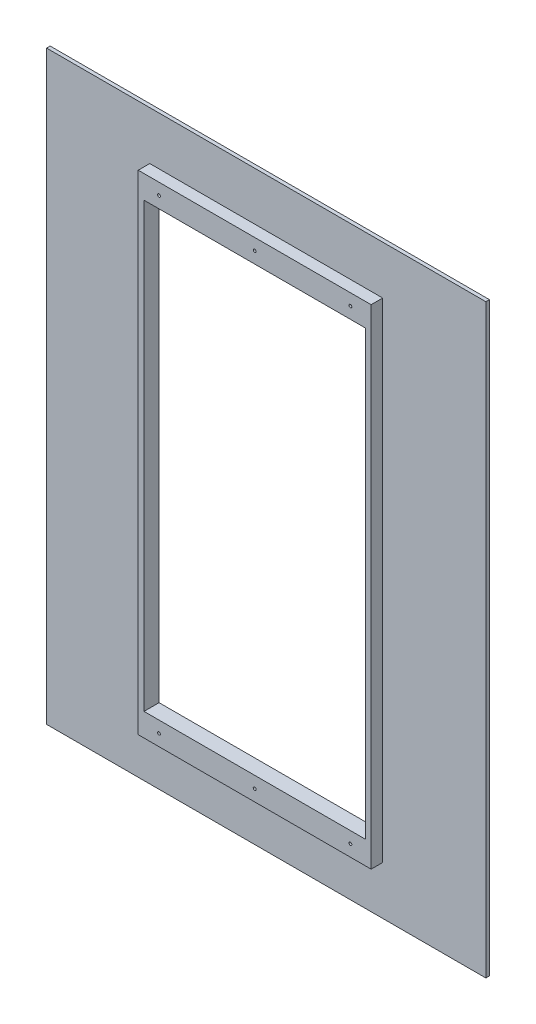
ISO-10303-21;
HEADER;
FILE_DESCRIPTION(('STEP AP214'),'2;1');
FILE_NAME('part.step','',(''),(''),'','','');
FILE_SCHEMA(('AUTOMOTIVE_DESIGN { 1 0 10303 214 1 1 1 1 }'));
ENDSEC;
DATA;
#1=APPLICATION_CONTEXT('core data for automotive mechanical design processes');
#2=APPLICATION_PROTOCOL_DEFINITION('international standard','automotive_design',2000,#1);
#3=PRODUCT_CONTEXT('',#1,'mechanical');
#4=PRODUCT('Part','Part','',(#3));
#5=PRODUCT_RELATED_PRODUCT_CATEGORY('part','',(#4));
#6=PRODUCT_DEFINITION_FORMATION('','',#4);
#7=PRODUCT_DEFINITION_CONTEXT('part definition',#1,'design');
#8=PRODUCT_DEFINITION('design','',#6,#7);
#9=PRODUCT_DEFINITION_SHAPE('','',#8);
#10=(LENGTH_UNIT() NAMED_UNIT(*) SI_UNIT(.MILLI.,.METRE.));
#11=(NAMED_UNIT(*) PLANE_ANGLE_UNIT() SI_UNIT($,.RADIAN.));
#12=(NAMED_UNIT(*) SI_UNIT($,.STERADIAN.) SOLID_ANGLE_UNIT());
#13=UNCERTAINTY_MEASURE_WITH_UNIT(LENGTH_MEASURE(1.E-05),#10,'distance_accuracy_value','');
#14=(GEOMETRIC_REPRESENTATION_CONTEXT(3) GLOBAL_UNCERTAINTY_ASSIGNED_CONTEXT((#13)) GLOBAL_UNIT_ASSIGNED_CONTEXT((#10,
#11,#12)) REPRESENTATION_CONTEXT('',''));
#15=CARTESIAN_POINT('',(0.,0.,0.));
#16=DIRECTION('',(0.,0.,1.));
#17=DIRECTION('',(1.,0.,0.));
#18=AXIS2_PLACEMENT_3D('',#15,#16,#17);
#19=CARTESIAN_POINT('',(-1.11022302462516E-13,508.,13.1));
#20=DIRECTION('',(0.,-1.,0.));
#21=DIRECTION('',(0.,0.,-1.));
#22=AXIS2_PLACEMENT_3D('',#19,#20,#21);
#23=PLANE('',#22);
#24=DIRECTION('',(-1.,0.,0.));
#25=VECTOR('',#24,1.);
#26=CARTESIAN_POINT('',(-1.11022302462516E-13,508.,3.1));
#27=LINE('',#26,#25);
#28=CARTESIAN_POINT('',(381.,508.,3.1));
#29=VERTEX_POINT('',#28);
#30=CARTESIAN_POINT('',(-1.11022302462516E-13,508.,3.1));
#31=VERTEX_POINT('',#30);
#32=EDGE_CURVE('E88',#29,#31,#27,.T.);
#33=ORIENTED_EDGE('',*,*,#32,.F.);
#34=DIRECTION('',(0.,0.,-1.));
#35=VECTOR('',#34,1.);
#36=CARTESIAN_POINT('',(381.,508.,13.1));
#37=LINE('',#36,#35);
#38=CARTESIAN_POINT('',(381.,508.,0.));
#39=VERTEX_POINT('',#38);
#40=EDGE_CURVE('E308',#29,#39,#37,.T.);
#41=ORIENTED_EDGE('',*,*,#40,.T.);
#42=DIRECTION('',(-1.,0.,0.));
#43=VECTOR('',#42,1.);
#44=CARTESIAN_POINT('',(-1.11022302462516E-13,508.,0.));
#45=LINE('',#44,#43);
#46=CARTESIAN_POINT('',(-1.11022302462516E-13,508.,0.));
#47=VERTEX_POINT('',#46);
#48=EDGE_CURVE('E301',#39,#47,#45,.T.);
#49=ORIENTED_EDGE('',*,*,#48,.T.);
#50=DIRECTION('',(0.,0.,-1.));
#51=VECTOR('',#50,1.);
#52=CARTESIAN_POINT('',(-1.11022302462516E-13,508.,13.1));
#53=LINE('',#52,#51);
#54=EDGE_CURVE('E305',#31,#47,#53,.T.);
#55=ORIENTED_EDGE('',*,*,#54,.F.);
#56=EDGE_LOOP('',(#33,#41,#49,#55));
#57=FACE_BOUND('',#56,.T.);
#58=ADVANCED_FACE('F64',(#57),#23,.F.);
#59=CARTESIAN_POINT('',(0.,0.,13.1));
#60=DIRECTION('',(1.,0.,0.));
#61=DIRECTION('',(0.,1.,0.));
#62=AXIS2_PLACEMENT_3D('',#59,#60,#61);
#63=PLANE('',#62);
#64=DIRECTION('',(0.,-1.,0.));
#65=VECTOR('',#64,1.);
#66=CARTESIAN_POINT('',(-1.11022302462516E-13,508.,3.1));
#67=LINE('',#66,#65);
#68=CARTESIAN_POINT('',(-1.11022302462516E-13,0.,3.1));
#69=VERTEX_POINT('',#68);
#70=EDGE_CURVE('E183',#31,#69,#67,.T.);
#71=ORIENTED_EDGE('',*,*,#70,.F.);
#72=ORIENTED_EDGE('',*,*,#54,.T.);
#73=DIRECTION('',(0.,-1.,0.));
#74=VECTOR('',#73,1.);
#75=CARTESIAN_POINT('',(0.,0.,0.));
#76=LINE('',#75,#74);
#77=CARTESIAN_POINT('',(0.,0.,0.));
#78=VERTEX_POINT('',#77);
#79=EDGE_CURVE('E289',#47,#78,#76,.T.);
#80=ORIENTED_EDGE('',*,*,#79,.T.);
#81=DIRECTION('',(0.,0.,-1.));
#82=VECTOR('',#81,1.);
#83=CARTESIAN_POINT('',(0.,0.,13.1));
#84=LINE('',#83,#82);
#85=EDGE_CURVE('E12',#69,#78,#84,.T.);
#86=ORIENTED_EDGE('',*,*,#85,.F.);
#87=EDGE_LOOP('',(#71,#72,#80,#86));
#88=FACE_BOUND('',#87,.T.);
#89=ADVANCED_FACE('F66',(#88),#63,.F.);
#90=CARTESIAN_POINT('',(0.,0.,13.1));
#91=DIRECTION('',(0.,0.,-1.));
#92=DIRECTION('',(-1.,0.,0.));
#93=AXIS2_PLACEMENT_3D('',#90,#91,#92);
#94=PLANE('',#93);
#95=CARTESIAN_POINT('',(190.5,456.,13.1));
#96=DIRECTION('',(0.,0.,1.));
#97=DIRECTION('',(1.,0.,0.));
#98=AXIS2_PLACEMENT_3D('',#95,#96,#97);
#99=CIRCLE('',#98,1.25000000000001);
#100=CARTESIAN_POINT('',(191.75,456.,13.1));
#101=VERTEX_POINT('',#100);
#102=EDGE_CURVE('E204',#101,#101,#99,.T.);
#103=ORIENTED_EDGE('',*,*,#102,.F.);
#104=EDGE_LOOP('',(#103));
#105=FACE_BOUND('',#104,.T.);
#106=CARTESIAN_POINT('',(190.5,52.,13.1));
#107=DIRECTION('',(0.,0.,1.));
#108=DIRECTION('',(1.,0.,0.));
#109=AXIS2_PLACEMENT_3D('',#106,#107,#108);
#110=CIRCLE('',#109,1.25000000000001);
#111=CARTESIAN_POINT('',(191.75,52.,13.1));
#112=VERTEX_POINT('',#111);
#113=EDGE_CURVE('E208',#112,#112,#110,.T.);
#114=ORIENTED_EDGE('',*,*,#113,.F.);
#115=EDGE_LOOP('',(#114));
#116=FACE_BOUND('',#115,.T.);
#117=CARTESIAN_POINT('',(273.5,456.,13.1));
#118=DIRECTION('',(0.,0.,1.));
#119=DIRECTION('',(1.,0.,0.));
#120=AXIS2_PLACEMENT_3D('',#117,#118,#119);
#121=CIRCLE('',#120,1.24999999999996);
#122=CARTESIAN_POINT('',(274.75,456.,13.1));
#123=VERTEX_POINT('',#122);
#124=EDGE_CURVE('E220',#123,#123,#121,.T.);
#125=ORIENTED_EDGE('',*,*,#124,.F.);
#126=EDGE_LOOP('',(#125));
#127=FACE_BOUND('',#126,.T.);
#128=CARTESIAN_POINT('',(107.5,52.,13.1));
#129=DIRECTION('',(0.,0.,1.));
#130=DIRECTION('',(1.,0.,0.));
#131=AXIS2_PLACEMENT_3D('',#128,#129,#130);
#132=CIRCLE('',#131,1.25);
#133=CARTESIAN_POINT('',(108.75,52.,13.1));
#134=VERTEX_POINT('',#133);
#135=EDGE_CURVE('E224',#134,#134,#132,.T.);
#136=ORIENTED_EDGE('',*,*,#135,.F.);
#137=EDGE_LOOP('',(#136));
#138=FACE_BOUND('',#137,.T.);
#139=CARTESIAN_POINT('',(273.5,52.,13.1));
#140=DIRECTION('',(0.,0.,1.));
#141=DIRECTION('',(1.,0.,0.));
#142=AXIS2_PLACEMENT_3D('',#139,#140,#141);
#143=CIRCLE('',#142,1.24999999999996);
#144=CARTESIAN_POINT('',(274.75,52.,13.1));
#145=VERTEX_POINT('',#144);
#146=EDGE_CURVE('E232',#145,#145,#143,.T.);
#147=ORIENTED_EDGE('',*,*,#146,.F.);
#148=EDGE_LOOP('',(#147));
#149=FACE_BOUND('',#148,.T.);
#150=CARTESIAN_POINT('',(107.5,456.,13.1));
#151=DIRECTION('',(0.,0.,1.));
#152=DIRECTION('',(1.,0.,0.));
#153=AXIS2_PLACEMENT_3D('',#150,#151,#152);
#154=CIRCLE('',#153,1.25);
#155=CARTESIAN_POINT('',(108.75,456.,13.1));
#156=VERTEX_POINT('',#155);
#157=EDGE_CURVE('E219',#156,#156,#154,.T.);
#158=ORIENTED_EDGE('',*,*,#157,.F.);
#159=EDGE_LOOP('',(#158));
#160=FACE_BOUND('',#159,.T.);
#161=DIRECTION('',(0.,-1.,0.));
#162=VECTOR('',#161,1.);
#163=CARTESIAN_POINT('',(291.5,508.,13.1));
#164=LINE('',#163,#162);
#165=CARTESIAN_POINT('',(291.5,466.,13.1));
#166=VERTEX_POINT('',#165);
#167=CARTESIAN_POINT('',(291.5,42.,13.1));
#168=VERTEX_POINT('',#167);
#169=EDGE_CURVE('E189',#166,#168,#164,.T.);
#170=ORIENTED_EDGE('',*,*,#169,.F.);
#171=DIRECTION('',(1.,0.,0.));
#172=VECTOR('',#171,1.);
#173=CARTESIAN_POINT('',(89.5,466.,13.1));
#174=LINE('',#173,#172);
#175=CARTESIAN_POINT('',(89.5,466.,13.1));
#176=VERTEX_POINT('',#175);
#177=EDGE_CURVE('E162',#176,#166,#174,.T.);
#178=ORIENTED_EDGE('',*,*,#177,.F.);
#179=DIRECTION('',(0.,1.,0.));
#180=VECTOR('',#179,1.);
#181=CARTESIAN_POINT('',(89.5,508.,13.1));
#182=LINE('',#181,#180);
#183=CARTESIAN_POINT('',(89.5000000000001,42.,13.1));
#184=VERTEX_POINT('',#183);
#185=EDGE_CURVE('E171',#184,#176,#182,.T.);
#186=ORIENTED_EDGE('',*,*,#185,.F.);
#187=DIRECTION('',(-1.,0.,0.));
#188=VECTOR('',#187,1.);
#189=CARTESIAN_POINT('',(89.5000000000001,42.,13.1));
#190=LINE('',#189,#188);
#191=EDGE_CURVE('E333',#168,#184,#190,.T.);
#192=ORIENTED_EDGE('',*,*,#191,.F.);
#193=EDGE_LOOP('',(#170,#178,#186,#192));
#194=FACE_BOUND('',#193,.T.);
#195=DIRECTION('',(0.,-1.,0.));
#196=VECTOR('',#195,1.);
#197=CARTESIAN_POINT('',(94.5,446.,13.1));
#198=LINE('',#197,#196);
#199=CARTESIAN_POINT('',(94.5,446.,13.1));
#200=VERTEX_POINT('',#199);
#201=CARTESIAN_POINT('',(94.5000000000001,62.,13.1));
#202=VERTEX_POINT('',#201);
#203=EDGE_CURVE('E247',#200,#202,#198,.T.);
#204=ORIENTED_EDGE('',*,*,#203,.F.);
#205=DIRECTION('',(-1.,0.,0.));
#206=VECTOR('',#205,1.);
#207=CARTESIAN_POINT('',(94.5,446.,13.1));
#208=LINE('',#207,#206);
#209=CARTESIAN_POINT('',(286.5,446.,13.1));
#210=VERTEX_POINT('',#209);
#211=EDGE_CURVE('E258',#210,#200,#208,.T.);
#212=ORIENTED_EDGE('',*,*,#211,.F.);
#213=DIRECTION('',(0.,1.,0.));
#214=VECTOR('',#213,1.);
#215=CARTESIAN_POINT('',(286.5,446.,13.1));
#216=LINE('',#215,#214);
#217=CARTESIAN_POINT('',(286.5,62.,13.1));
#218=VERTEX_POINT('',#217);
#219=EDGE_CURVE('E254',#218,#210,#216,.T.);
#220=ORIENTED_EDGE('',*,*,#219,.F.);
#221=DIRECTION('',(1.,0.,0.));
#222=VECTOR('',#221,1.);
#223=CARTESIAN_POINT('',(94.5000000000001,62.,13.1));
#224=LINE('',#223,#222);
#225=EDGE_CURVE('E250',#202,#218,#224,.T.);
#226=ORIENTED_EDGE('',*,*,#225,.F.);
#227=EDGE_LOOP('',(#204,#212,#220,#226));
#228=FACE_BOUND('',#227,.T.);
#229=ADVANCED_FACE('F351',(#105,#116,#127,#138,#149,#160,#194,#228),#94,.F.);
#230=CARTESIAN_POINT('',(0.,0.,0.));
#231=DIRECTION('',(0.,0.,-1.));
#232=DIRECTION('',(-1.,0.,0.));
#233=AXIS2_PLACEMENT_3D('',#230,#231,#232);
#234=PLANE('',#233);
#235=ORIENTED_EDGE('',*,*,#79,.F.);
#236=ORIENTED_EDGE('',*,*,#48,.F.);
#237=DIRECTION('',(0.,1.,0.));
#238=VECTOR('',#237,1.);
#239=CARTESIAN_POINT('',(381.,0.,0.));
#240=LINE('',#239,#238);
#241=CARTESIAN_POINT('',(381.,0.,0.));
#242=VERTEX_POINT('',#241);
#243=EDGE_CURVE('E297',#242,#39,#240,.T.);
#244=ORIENTED_EDGE('',*,*,#243,.F.);
#245=DIRECTION('',(1.,0.,0.));
#246=VECTOR('',#245,1.);
#247=CARTESIAN_POINT('',(0.,0.,0.));
#248=LINE('',#247,#246);
#249=EDGE_CURVE('E293',#78,#242,#248,.T.);
#250=ORIENTED_EDGE('',*,*,#249,.F.);
#251=EDGE_LOOP('',(#235,#236,#244,#250));
#252=FACE_BOUND('',#251,.T.);
#253=DIRECTION('',(-1.,0.,0.));
#254=VECTOR('',#253,1.);
#255=CARTESIAN_POINT('',(94.5,446.,0.));
#256=LINE('',#255,#254);
#257=CARTESIAN_POINT('',(286.5,446.,0.));
#258=VERTEX_POINT('',#257);
#259=CARTESIAN_POINT('',(94.5,446.,0.));
#260=VERTEX_POINT('',#259);
#261=EDGE_CURVE('E251',#258,#260,#256,.T.);
#262=ORIENTED_EDGE('',*,*,#261,.T.);
#263=DIRECTION('',(0.,-1.,0.));
#264=VECTOR('',#263,1.);
#265=CARTESIAN_POINT('',(94.5,446.,0.));
#266=LINE('',#265,#264);
#267=CARTESIAN_POINT('',(94.5000000000001,62.,0.));
#268=VERTEX_POINT('',#267);
#269=EDGE_CURVE('E243',#260,#268,#266,.T.);
#270=ORIENTED_EDGE('',*,*,#269,.T.);
#271=DIRECTION('',(1.,0.,0.));
#272=VECTOR('',#271,1.);
#273=CARTESIAN_POINT('',(94.5000000000001,62.,0.));
#274=LINE('',#273,#272);
#275=CARTESIAN_POINT('',(286.5,62.,0.));
#276=VERTEX_POINT('',#275);
#277=EDGE_CURVE('E265',#268,#276,#274,.T.);
#278=ORIENTED_EDGE('',*,*,#277,.T.);
#279=DIRECTION('',(0.,1.,0.));
#280=VECTOR('',#279,1.);
#281=CARTESIAN_POINT('',(286.5,446.,0.));
#282=LINE('',#281,#280);
#283=EDGE_CURVE('E269',#276,#258,#282,.T.);
#284=ORIENTED_EDGE('',*,*,#283,.T.);
#285=EDGE_LOOP('',(#262,#270,#278,#284));
#286=FACE_BOUND('',#285,.T.);
#287=ADVANCED_FACE('F325',(#252,#286),#234,.T.);
#288=CARTESIAN_POINT('',(0.,0.,13.1));
#289=DIRECTION('',(0.,1.,0.));
#290=DIRECTION('',(0.,0.,1.));
#291=AXIS2_PLACEMENT_3D('',#288,#289,#290);
#292=PLANE('',#291);
#293=DIRECTION('',(0.,0.,-1.));
#294=VECTOR('',#293,1.);
#295=CARTESIAN_POINT('',(381.,0.,13.1));
#296=LINE('',#295,#294);
#297=CARTESIAN_POINT('',(381.,0.,3.1));
#298=VERTEX_POINT('',#297);
#299=EDGE_CURVE('E73',#298,#242,#296,.T.);
#300=ORIENTED_EDGE('',*,*,#299,.F.);
#301=DIRECTION('',(1.,0.,0.));
#302=VECTOR('',#301,1.);
#303=CARTESIAN_POINT('',(-1.11022302462516E-13,0.,3.1));
#304=LINE('',#303,#302);
#305=EDGE_CURVE('E177',#69,#298,#304,.T.);
#306=ORIENTED_EDGE('',*,*,#305,.F.);
#307=ORIENTED_EDGE('',*,*,#85,.T.);
#308=ORIENTED_EDGE('',*,*,#249,.T.);
#309=EDGE_LOOP('',(#300,#306,#307,#308));
#310=FACE_BOUND('',#309,.T.);
#311=ADVANCED_FACE('F321',(#310),#292,.F.);
#312=CARTESIAN_POINT('',(381.,0.,13.1));
#313=DIRECTION('',(-1.,0.,0.));
#314=DIRECTION('',(0.,-1.,0.));
#315=AXIS2_PLACEMENT_3D('',#312,#313,#314);
#316=PLANE('',#315);
#317=ORIENTED_EDGE('',*,*,#40,.F.);
#318=DIRECTION('',(0.,1.,0.));
#319=VECTOR('',#318,1.);
#320=CARTESIAN_POINT('',(381.,508.,3.1));
#321=LINE('',#320,#319);
#322=EDGE_CURVE('E193',#298,#29,#321,.T.);
#323=ORIENTED_EDGE('',*,*,#322,.F.);
#324=ORIENTED_EDGE('',*,*,#299,.T.);
#325=ORIENTED_EDGE('',*,*,#243,.T.);
#326=EDGE_LOOP('',(#317,#323,#324,#325));
#327=FACE_BOUND('',#326,.T.);
#328=ADVANCED_FACE('F315',(#327),#316,.F.);
#329=CARTESIAN_POINT('',(94.5,446.,13.1));
#330=DIRECTION('',(1.,0.,0.));
#331=DIRECTION('',(0.,1.,0.));
#332=AXIS2_PLACEMENT_3D('',#329,#330,#331);
#333=PLANE('',#332);
#334=ORIENTED_EDGE('',*,*,#269,.F.);
#335=DIRECTION('',(0.,0.,-1.));
#336=VECTOR('',#335,1.);
#337=CARTESIAN_POINT('',(94.5,446.,13.1));
#338=LINE('',#337,#336);
#339=EDGE_CURVE('E261',#200,#260,#338,.T.);
#340=ORIENTED_EDGE('',*,*,#339,.F.);
#341=ORIENTED_EDGE('',*,*,#203,.T.);
#342=DIRECTION('',(0.,0.,-1.));
#343=VECTOR('',#342,1.);
#344=CARTESIAN_POINT('',(94.5000000000001,62.,13.1));
#345=LINE('',#344,#343);
#346=EDGE_CURVE('E285',#202,#268,#345,.T.);
#347=ORIENTED_EDGE('',*,*,#346,.T.);
#348=EDGE_LOOP('',(#334,#340,#341,#347));
#349=FACE_BOUND('',#348,.T.);
#350=ADVANCED_FACE('F372',(#349),#333,.T.);
#351=CARTESIAN_POINT('',(94.5000000000001,62.,13.1));
#352=DIRECTION('',(0.,1.,0.));
#353=DIRECTION('',(-1.,0.,0.));
#354=AXIS2_PLACEMENT_3D('',#351,#352,#353);
#355=PLANE('',#354);
#356=ORIENTED_EDGE('',*,*,#277,.F.);
#357=ORIENTED_EDGE('',*,*,#346,.F.);
#358=ORIENTED_EDGE('',*,*,#225,.T.);
#359=DIRECTION('',(0.,0.,-1.));
#360=VECTOR('',#359,1.);
#361=CARTESIAN_POINT('',(286.5,62.,13.1));
#362=LINE('',#361,#360);
#363=EDGE_CURVE('E282',#218,#276,#362,.T.);
#364=ORIENTED_EDGE('',*,*,#363,.T.);
#365=EDGE_LOOP('',(#356,#357,#358,#364));
#366=FACE_BOUND('',#365,.T.);
#367=ADVANCED_FACE('F388',(#366),#355,.T.);
#368=CARTESIAN_POINT('',(286.5,446.,13.1));
#369=DIRECTION('',(-1.,0.,0.));
#370=DIRECTION('',(0.,0.,1.));
#371=AXIS2_PLACEMENT_3D('',#368,#369,#370);
#372=PLANE('',#371);
#373=ORIENTED_EDGE('',*,*,#283,.F.);
#374=ORIENTED_EDGE('',*,*,#363,.F.);
#375=ORIENTED_EDGE('',*,*,#219,.T.);
#376=DIRECTION('',(0.,0.,-1.));
#377=VECTOR('',#376,1.);
#378=CARTESIAN_POINT('',(286.5,446.,13.1));
#379=LINE('',#378,#377);
#380=EDGE_CURVE('E279',#210,#258,#379,.T.);
#381=ORIENTED_EDGE('',*,*,#380,.T.);
#382=EDGE_LOOP('',(#373,#374,#375,#381));
#383=FACE_BOUND('',#382,.T.);
#384=ADVANCED_FACE('F392',(#383),#372,.T.);
#385=CARTESIAN_POINT('',(94.5,446.,13.1));
#386=DIRECTION('',(0.,-1.,0.));
#387=DIRECTION('',(0.,0.,-1.));
#388=AXIS2_PLACEMENT_3D('',#385,#386,#387);
#389=PLANE('',#388);
#390=ORIENTED_EDGE('',*,*,#261,.F.);
#391=ORIENTED_EDGE('',*,*,#380,.F.);
#392=ORIENTED_EDGE('',*,*,#211,.T.);
#393=ORIENTED_EDGE('',*,*,#339,.T.);
#394=EDGE_LOOP('',(#390,#391,#392,#393));
#395=FACE_BOUND('',#394,.T.);
#396=ADVANCED_FACE('F396',(#395),#389,.T.);
#397=CARTESIAN_POINT('',(107.5,456.,3.1));
#398=DIRECTION('',(0.,0.,1.));
#399=DIRECTION('',(1.,0.,0.));
#400=AXIS2_PLACEMENT_3D('',#397,#398,#399);
#401=CYLINDRICAL_SURFACE('',#400,1.25);
#402=CARTESIAN_POINT('',(107.5,456.,3.1));
#403=DIRECTION('',(0.,0.,1.));
#404=DIRECTION('',(1.,0.,0.));
#405=AXIS2_PLACEMENT_3D('',#402,#403,#404);
#406=CIRCLE('',#405,1.25);
#407=CARTESIAN_POINT('',(108.75,456.,3.1));
#408=VERTEX_POINT('',#407);
#409=EDGE_CURVE('E239',#408,#408,#406,.T.);
#410=ORIENTED_EDGE('',*,*,#409,.F.);
#411=EDGE_LOOP('',(#410));
#412=FACE_BOUND('',#411,.T.);
#413=ORIENTED_EDGE('',*,*,#157,.T.);
#414=EDGE_LOOP('',(#413));
#415=FACE_BOUND('',#414,.T.);
#416=ADVANCED_FACE('F400',(#412,#415),#401,.F.);
#417=CARTESIAN_POINT('',(107.5,456.,3.1));
#418=DIRECTION('',(0.,0.,1.));
#419=DIRECTION('',(1.,0.,0.));
#420=AXIS2_PLACEMENT_3D('',#417,#418,#419);
#421=PLANE('',#420);
#422=ORIENTED_EDGE('',*,*,#409,.T.);
#423=EDGE_LOOP('',(#422));
#424=FACE_BOUND('',#423,.T.);
#425=ADVANCED_FACE('F404',(#424),#421,.T.);
#426=CARTESIAN_POINT('',(273.5,52.,3.1));
#427=DIRECTION('',(0.,0.,1.));
#428=DIRECTION('',(1.,0.,0.));
#429=AXIS2_PLACEMENT_3D('',#426,#427,#428);
#430=CYLINDRICAL_SURFACE('',#429,1.24999999999996);
#431=CARTESIAN_POINT('',(273.5,52.,3.1));
#432=DIRECTION('',(0.,0.,1.));
#433=DIRECTION('',(1.,0.,0.));
#434=AXIS2_PLACEMENT_3D('',#431,#432,#433);
#435=CIRCLE('',#434,1.24999999999996);
#436=CARTESIAN_POINT('',(274.75,52.,3.1));
#437=VERTEX_POINT('',#436);
#438=EDGE_CURVE('E203',#437,#437,#435,.T.);
#439=ORIENTED_EDGE('',*,*,#438,.F.);
#440=EDGE_LOOP('',(#439));
#441=FACE_BOUND('',#440,.T.);
#442=ORIENTED_EDGE('',*,*,#146,.T.);
#443=EDGE_LOOP('',(#442));
#444=FACE_BOUND('',#443,.T.);
#445=ADVANCED_FACE('F408',(#441,#444),#430,.F.);
#446=CARTESIAN_POINT('',(273.5,52.,3.1));
#447=DIRECTION('',(0.,0.,1.));
#448=DIRECTION('',(1.,0.,0.));
#449=AXIS2_PLACEMENT_3D('',#446,#447,#448);
#450=PLANE('',#449);
#451=ORIENTED_EDGE('',*,*,#438,.T.);
#452=EDGE_LOOP('',(#451));
#453=FACE_BOUND('',#452,.T.);
#454=ADVANCED_FACE('F410',(#453),#450,.T.);
#455=CARTESIAN_POINT('',(107.5,52.,3.1));
#456=DIRECTION('',(0.,0.,1.));
#457=DIRECTION('',(1.,0.,0.));
#458=AXIS2_PLACEMENT_3D('',#455,#456,#457);
#459=CYLINDRICAL_SURFACE('',#458,1.25);
#460=CARTESIAN_POINT('',(107.5,52.,3.1));
#461=DIRECTION('',(0.,0.,1.));
#462=DIRECTION('',(1.,0.,0.));
#463=AXIS2_PLACEMENT_3D('',#460,#461,#462);
#464=CIRCLE('',#463,1.25);
#465=CARTESIAN_POINT('',(108.75,52.,3.1));
#466=VERTEX_POINT('',#465);
#467=EDGE_CURVE('E228',#466,#466,#464,.T.);
#468=ORIENTED_EDGE('',*,*,#467,.F.);
#469=EDGE_LOOP('',(#468));
#470=FACE_BOUND('',#469,.T.);
#471=ORIENTED_EDGE('',*,*,#135,.T.);
#472=EDGE_LOOP('',(#471));
#473=FACE_BOUND('',#472,.T.);
#474=ADVANCED_FACE('F413',(#470,#473),#459,.F.);
#475=CARTESIAN_POINT('',(107.5,52.,3.1));
#476=DIRECTION('',(0.,0.,1.));
#477=DIRECTION('',(1.,0.,0.));
#478=AXIS2_PLACEMENT_3D('',#475,#476,#477);
#479=PLANE('',#478);
#480=ORIENTED_EDGE('',*,*,#467,.T.);
#481=EDGE_LOOP('',(#480));
#482=FACE_BOUND('',#481,.T.);
#483=ADVANCED_FACE('F418',(#482),#479,.T.);
#484=CARTESIAN_POINT('',(273.5,456.,3.1));
#485=DIRECTION('',(0.,0.,1.));
#486=DIRECTION('',(1.,0.,0.));
#487=AXIS2_PLACEMENT_3D('',#484,#485,#486);
#488=CYLINDRICAL_SURFACE('',#487,1.24999999999996);
#489=CARTESIAN_POINT('',(273.5,456.,3.1));
#490=DIRECTION('',(0.,0.,1.));
#491=DIRECTION('',(1.,0.,0.));
#492=AXIS2_PLACEMENT_3D('',#489,#490,#491);
#493=CIRCLE('',#492,1.24999999999996);
#494=CARTESIAN_POINT('',(274.75,456.,3.1));
#495=VERTEX_POINT('',#494);
#496=EDGE_CURVE('E215',#495,#495,#493,.T.);
#497=ORIENTED_EDGE('',*,*,#496,.F.);
#498=EDGE_LOOP('',(#497));
#499=FACE_BOUND('',#498,.T.);
#500=ORIENTED_EDGE('',*,*,#124,.T.);
#501=EDGE_LOOP('',(#500));
#502=FACE_BOUND('',#501,.T.);
#503=ADVANCED_FACE('F421',(#499,#502),#488,.F.);
#504=CARTESIAN_POINT('',(273.5,456.,3.1));
#505=DIRECTION('',(0.,0.,1.));
#506=DIRECTION('',(1.,0.,0.));
#507=AXIS2_PLACEMENT_3D('',#504,#505,#506);
#508=PLANE('',#507);
#509=ORIENTED_EDGE('',*,*,#496,.T.);
#510=EDGE_LOOP('',(#509));
#511=FACE_BOUND('',#510,.T.);
#512=ADVANCED_FACE('F428',(#511),#508,.T.);
#513=CARTESIAN_POINT('',(190.5,52.,3.1));
#514=DIRECTION('',(0.,0.,1.));
#515=DIRECTION('',(1.,0.,0.));
#516=AXIS2_PLACEMENT_3D('',#513,#514,#515);
#517=CYLINDRICAL_SURFACE('',#516,1.25000000000001);
#518=CARTESIAN_POINT('',(190.5,52.,3.1));
#519=DIRECTION('',(0.,0.,1.));
#520=DIRECTION('',(1.,0.,0.));
#521=AXIS2_PLACEMENT_3D('',#518,#519,#520);
#522=CIRCLE('',#521,1.25000000000001);
#523=CARTESIAN_POINT('',(191.75,52.,3.1));
#524=VERTEX_POINT('',#523);
#525=EDGE_CURVE('E181',#524,#524,#522,.T.);
#526=ORIENTED_EDGE('',*,*,#525,.F.);
#527=EDGE_LOOP('',(#526));
#528=FACE_BOUND('',#527,.T.);
#529=ORIENTED_EDGE('',*,*,#113,.T.);
#530=EDGE_LOOP('',(#529));
#531=FACE_BOUND('',#530,.T.);
#532=ADVANCED_FACE('F432',(#528,#531),#517,.F.);
#533=CARTESIAN_POINT('',(190.5,52.,3.1));
#534=DIRECTION('',(0.,0.,1.));
#535=DIRECTION('',(1.,0.,0.));
#536=AXIS2_PLACEMENT_3D('',#533,#534,#535);
#537=PLANE('',#536);
#538=ORIENTED_EDGE('',*,*,#525,.T.);
#539=EDGE_LOOP('',(#538));
#540=FACE_BOUND('',#539,.T.);
#541=ADVANCED_FACE('F434',(#540),#537,.T.);
#542=CARTESIAN_POINT('',(190.5,456.,3.1));
#543=DIRECTION('',(0.,0.,1.));
#544=DIRECTION('',(1.,0.,0.));
#545=AXIS2_PLACEMENT_3D('',#542,#543,#544);
#546=CYLINDRICAL_SURFACE('',#545,1.25000000000001);
#547=CARTESIAN_POINT('',(190.5,456.,3.1));
#548=DIRECTION('',(0.,0.,1.));
#549=DIRECTION('',(1.,0.,0.));
#550=AXIS2_PLACEMENT_3D('',#547,#548,#549);
#551=CIRCLE('',#550,1.25000000000001);
#552=CARTESIAN_POINT('',(191.75,456.,3.1));
#553=VERTEX_POINT('',#552);
#554=EDGE_CURVE('E199',#553,#553,#551,.T.);
#555=ORIENTED_EDGE('',*,*,#554,.F.);
#556=EDGE_LOOP('',(#555));
#557=FACE_BOUND('',#556,.T.);
#558=ORIENTED_EDGE('',*,*,#102,.T.);
#559=EDGE_LOOP('',(#558));
#560=FACE_BOUND('',#559,.T.);
#561=ADVANCED_FACE('F437',(#557,#560),#546,.F.);
#562=CARTESIAN_POINT('',(190.5,456.,3.1));
#563=DIRECTION('',(0.,0.,1.));
#564=DIRECTION('',(1.,0.,0.));
#565=AXIS2_PLACEMENT_3D('',#562,#563,#564);
#566=PLANE('',#565);
#567=ORIENTED_EDGE('',*,*,#554,.T.);
#568=EDGE_LOOP('',(#567));
#569=FACE_BOUND('',#568,.T.);
#570=ADVANCED_FACE('F444',(#569),#566,.T.);
#571=CARTESIAN_POINT('',(291.5,508.,3.1));
#572=DIRECTION('',(-1.,0.,0.));
#573=DIRECTION('',(0.,-1.,0.));
#574=AXIS2_PLACEMENT_3D('',#571,#572,#573);
#575=PLANE('',#574);
#576=DIRECTION('',(0.,-1.,0.));
#577=VECTOR('',#576,1.);
#578=CARTESIAN_POINT('',(291.5,508.,3.1));
#579=LINE('',#578,#577);
#580=CARTESIAN_POINT('',(291.5,466.,3.1));
#581=VERTEX_POINT('',#580);
#582=CARTESIAN_POINT('',(291.5,42.,3.1));
#583=VERTEX_POINT('',#582);
#584=EDGE_CURVE('E194',#581,#583,#579,.T.);
#585=ORIENTED_EDGE('',*,*,#584,.F.);
#586=DIRECTION('',(0.,0.,1.));
#587=VECTOR('',#586,1.);
#588=CARTESIAN_POINT('',(291.5,466.,3.1));
#589=LINE('',#588,#587);
#590=EDGE_CURVE('E159',#581,#166,#589,.T.);
#591=ORIENTED_EDGE('',*,*,#590,.T.);
#592=ORIENTED_EDGE('',*,*,#169,.T.);
#593=DIRECTION('',(0.,0.,1.));
#594=VECTOR('',#593,1.);
#595=CARTESIAN_POINT('',(291.5,42.,3.1));
#596=LINE('',#595,#594);
#597=EDGE_CURVE('E334',#583,#168,#596,.T.);
#598=ORIENTED_EDGE('',*,*,#597,.F.);
#599=EDGE_LOOP('',(#585,#591,#592,#598));
#600=FACE_BOUND('',#599,.T.);
#601=ADVANCED_FACE('F348',(#600),#575,.F.);
#602=CARTESIAN_POINT('',(89.5,508.,3.1));
#603=DIRECTION('',(1.,0.,0.));
#604=DIRECTION('',(0.,1.,0.));
#605=AXIS2_PLACEMENT_3D('',#602,#603,#604);
#606=PLANE('',#605);
#607=ORIENTED_EDGE('',*,*,#185,.T.);
#608=DIRECTION('',(0.,0.,1.));
#609=VECTOR('',#608,1.);
#610=CARTESIAN_POINT('',(89.5,466.,3.1));
#611=LINE('',#610,#609);
#612=CARTESIAN_POINT('',(89.5,466.,3.1));
#613=VERTEX_POINT('',#612);
#614=EDGE_CURVE('E156',#613,#176,#611,.T.);
#615=ORIENTED_EDGE('',*,*,#614,.F.);
#616=DIRECTION('',(0.,1.,0.));
#617=VECTOR('',#616,1.);
#618=CARTESIAN_POINT('',(89.5,508.,3.1));
#619=LINE('',#618,#617);
#620=CARTESIAN_POINT('',(89.5000000000001,42.,3.1));
#621=VERTEX_POINT('',#620);
#622=EDGE_CURVE('E169',#621,#613,#619,.T.);
#623=ORIENTED_EDGE('',*,*,#622,.F.);
#624=DIRECTION('',(0.,0.,1.));
#625=VECTOR('',#624,1.);
#626=CARTESIAN_POINT('',(89.5000000000001,42.,3.1));
#627=LINE('',#626,#625);
#628=EDGE_CURVE('E337',#621,#184,#627,.T.);
#629=ORIENTED_EDGE('',*,*,#628,.T.);
#630=EDGE_LOOP('',(#607,#615,#623,#629));
#631=FACE_BOUND('',#630,.T.);
#632=ADVANCED_FACE('F167',(#631),#606,.F.);
#633=CARTESIAN_POINT('',(0.,0.,3.1));
#634=DIRECTION('',(0.,0.,1.));
#635=DIRECTION('',(1.,0.,0.));
#636=AXIS2_PLACEMENT_3D('',#633,#634,#635);
#637=PLANE('',#636);
#638=DIRECTION('',(1.,0.,0.));
#639=VECTOR('',#638,1.);
#640=CARTESIAN_POINT('',(89.5,466.,3.1));
#641=LINE('',#640,#639);
#642=EDGE_CURVE('E153',#613,#581,#641,.T.);
#643=ORIENTED_EDGE('',*,*,#642,.T.);
#644=ORIENTED_EDGE('',*,*,#584,.T.);
#645=DIRECTION('',(-1.,0.,0.));
#646=VECTOR('',#645,1.);
#647=CARTESIAN_POINT('',(89.5000000000001,42.,3.1));
#648=LINE('',#647,#646);
#649=EDGE_CURVE('E80',#583,#621,#648,.T.);
#650=ORIENTED_EDGE('',*,*,#649,.T.);
#651=ORIENTED_EDGE('',*,*,#622,.T.);
#652=EDGE_LOOP('',(#643,#644,#650,#651));
#653=FACE_BOUND('',#652,.T.);
#654=ORIENTED_EDGE('',*,*,#70,.T.);
#655=ORIENTED_EDGE('',*,*,#305,.T.);
#656=ORIENTED_EDGE('',*,*,#322,.T.);
#657=ORIENTED_EDGE('',*,*,#32,.T.);
#658=EDGE_LOOP('',(#654,#655,#656,#657));
#659=FACE_BOUND('',#658,.T.);
#660=ADVANCED_FACE('F174',(#653,#659),#637,.T.);
#661=CARTESIAN_POINT('',(89.5000000000001,42.,3.1));
#662=DIRECTION('',(0.,1.,0.));
#663=DIRECTION('',(0.,0.,1.));
#664=AXIS2_PLACEMENT_3D('',#661,#662,#663);
#665=PLANE('',#664);
#666=ORIENTED_EDGE('',*,*,#191,.T.);
#667=ORIENTED_EDGE('',*,*,#628,.F.);
#668=ORIENTED_EDGE('',*,*,#649,.F.);
#669=ORIENTED_EDGE('',*,*,#597,.T.);
#670=EDGE_LOOP('',(#666,#667,#668,#669));
#671=FACE_BOUND('',#670,.T.);
#672=ADVANCED_FACE('F354',(#671),#665,.F.);
#673=CARTESIAN_POINT('',(89.5,466.,3.1));
#674=DIRECTION('',(0.,-1.,0.));
#675=DIRECTION('',(0.,0.,-1.));
#676=AXIS2_PLACEMENT_3D('',#673,#674,#675);
#677=PLANE('',#676);
#678=ORIENTED_EDGE('',*,*,#177,.T.);
#679=ORIENTED_EDGE('',*,*,#590,.F.);
#680=ORIENTED_EDGE('',*,*,#642,.F.);
#681=ORIENTED_EDGE('',*,*,#614,.T.);
#682=EDGE_LOOP('',(#678,#679,#680,#681));
#683=FACE_BOUND('',#682,.T.);
#684=ADVANCED_FACE('F155',(#683),#677,.F.);
#685=CLOSED_SHELL('',(#58,#89,#229,#287,#311,#328,#350,#367,#384,#396,#416,#425,#445,#454,#474,
#483,#503,#512,#532,#541,#561,#570,#601,#632,#660,#672,#684));
#686=MANIFOLD_SOLID_BREP('B2',#685);
#687=ADVANCED_BREP_SHAPE_REPRESENTATION('',(#18,#686),#14);
#688=SHAPE_DEFINITION_REPRESENTATION(#9,#687);
ENDSEC;
END-ISO-10303-21;
